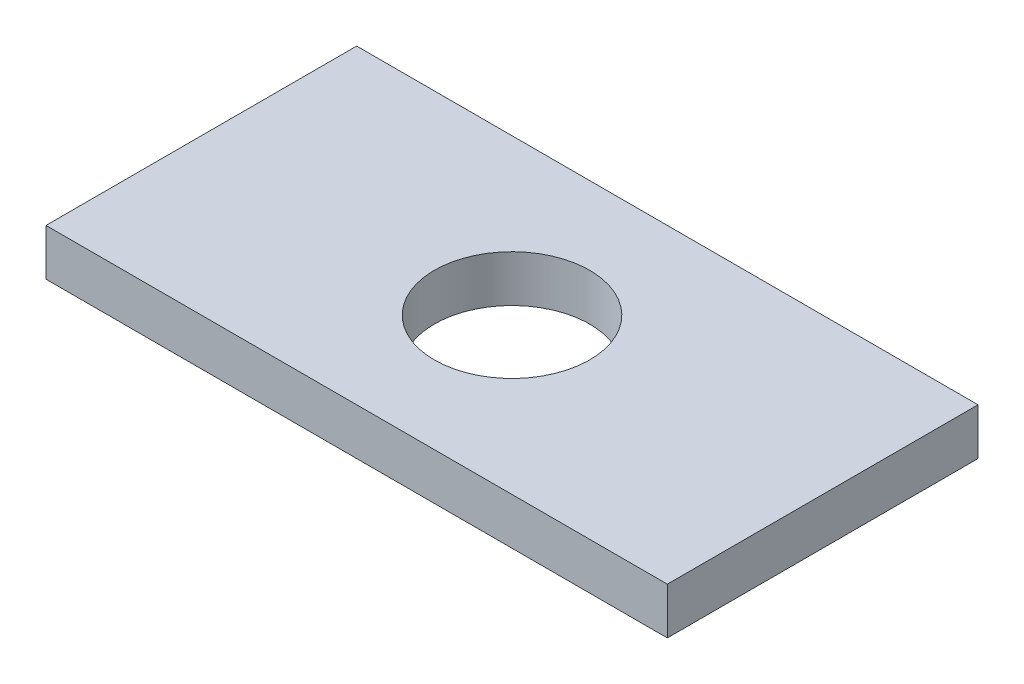
ISO-10303-21;
HEADER;
FILE_DESCRIPTION(('STEP AP214'),'2;1');
FILE_NAME('part.step','',(''),(''),'','','');
FILE_SCHEMA(('AUTOMOTIVE_DESIGN { 1 0 10303 214 1 1 1 1 }'));
ENDSEC;
DATA;
#1=APPLICATION_CONTEXT('core data for automotive mechanical design processes');
#2=APPLICATION_PROTOCOL_DEFINITION('international standard','automotive_design',2000,#1);
#3=PRODUCT_CONTEXT('',#1,'mechanical');
#4=PRODUCT('Part','Part','',(#3));
#5=PRODUCT_RELATED_PRODUCT_CATEGORY('part','',(#4));
#6=PRODUCT_DEFINITION_FORMATION('','',#4);
#7=PRODUCT_DEFINITION_CONTEXT('part definition',#1,'design');
#8=PRODUCT_DEFINITION('design','',#6,#7);
#9=PRODUCT_DEFINITION_SHAPE('','',#8);
#10=(LENGTH_UNIT() NAMED_UNIT(*) SI_UNIT(.MILLI.,.METRE.));
#11=(NAMED_UNIT(*) PLANE_ANGLE_UNIT() SI_UNIT($,.RADIAN.));
#12=(NAMED_UNIT(*) SI_UNIT($,.STERADIAN.) SOLID_ANGLE_UNIT());
#13=UNCERTAINTY_MEASURE_WITH_UNIT(LENGTH_MEASURE(1.E-05),#10,'distance_accuracy_value','');
#14=(GEOMETRIC_REPRESENTATION_CONTEXT(3) GLOBAL_UNCERTAINTY_ASSIGNED_CONTEXT((#13)) GLOBAL_UNIT_ASSIGNED_CONTEXT((#10,
#11,#12)) REPRESENTATION_CONTEXT('',''));
#15=CARTESIAN_POINT('',(0.,0.,0.));
#16=DIRECTION('',(0.,0.,1.));
#17=DIRECTION('',(1.,0.,0.));
#18=AXIS2_PLACEMENT_3D('',#15,#16,#17);
#19=CARTESIAN_POINT('',(20.,-3.,10.));
#20=DIRECTION('',(1.,0.,0.));
#21=DIRECTION('',(0.,0.,-1.));
#22=AXIS2_PLACEMENT_3D('',#19,#20,#21);
#23=PLANE('',#22);
#24=DIRECTION('',(0.,0.,-1.));
#25=VECTOR('',#24,1.);
#26=CARTESIAN_POINT('',(20.,0.,10.));
#27=LINE('',#26,#25);
#28=CARTESIAN_POINT('',(20.,0.,10.));
#29=VERTEX_POINT('',#28);
#30=CARTESIAN_POINT('',(20.,0.,-10.));
#31=VERTEX_POINT('',#30);
#32=EDGE_CURVE('E100',#29,#31,#27,.T.);
#33=ORIENTED_EDGE('',*,*,#32,.F.);
#34=DIRECTION('',(0.,1.,0.));
#35=VECTOR('',#34,1.);
#36=CARTESIAN_POINT('',(20.,-3.,10.));
#37=LINE('',#36,#35);
#38=CARTESIAN_POINT('',(20.,-3.,10.));
#39=VERTEX_POINT('',#38);
#40=EDGE_CURVE('E11',#39,#29,#37,.T.);
#41=ORIENTED_EDGE('',*,*,#40,.F.);
#42=DIRECTION('',(0.,0.,-1.));
#43=VECTOR('',#42,1.);
#44=CARTESIAN_POINT('',(20.,-3.,10.));
#45=LINE('',#44,#43);
#46=CARTESIAN_POINT('',(20.,-3.,-10.));
#47=VERTEX_POINT('',#46);
#48=EDGE_CURVE('E93',#39,#47,#45,.T.);
#49=ORIENTED_EDGE('',*,*,#48,.T.);
#50=DIRECTION('',(0.,1.,0.));
#51=VECTOR('',#50,1.);
#52=CARTESIAN_POINT('',(20.,-3.,-10.));
#53=LINE('',#52,#51);
#54=EDGE_CURVE('E38',#47,#31,#53,.T.);
#55=ORIENTED_EDGE('',*,*,#54,.T.);
#56=EDGE_LOOP('',(#33,#41,#49,#55));
#57=FACE_BOUND('',#56,.T.);
#58=ADVANCED_FACE('F35',(#57),#23,.T.);
#59=CARTESIAN_POINT('',(-20.,-3.,10.));
#60=DIRECTION('',(0.,0.,1.));
#61=DIRECTION('',(1.,0.,0.));
#62=AXIS2_PLACEMENT_3D('',#59,#60,#61);
#63=PLANE('',#62);
#64=DIRECTION('',(1.,0.,0.));
#65=VECTOR('',#64,1.);
#66=CARTESIAN_POINT('',(-20.,0.,10.));
#67=LINE('',#66,#65);
#68=CARTESIAN_POINT('',(-20.,0.,10.));
#69=VERTEX_POINT('',#68);
#70=EDGE_CURVE('E95',#69,#29,#67,.T.);
#71=ORIENTED_EDGE('',*,*,#70,.F.);
#72=DIRECTION('',(0.,1.,0.));
#73=VECTOR('',#72,1.);
#74=CARTESIAN_POINT('',(-20.,-3.,10.));
#75=LINE('',#74,#73);
#76=CARTESIAN_POINT('',(-20.,-3.,10.));
#77=VERTEX_POINT('',#76);
#78=EDGE_CURVE('E44',#77,#69,#75,.T.);
#79=ORIENTED_EDGE('',*,*,#78,.F.);
#80=DIRECTION('',(1.,0.,0.));
#81=VECTOR('',#80,1.);
#82=CARTESIAN_POINT('',(-20.,-3.,10.));
#83=LINE('',#82,#81);
#84=EDGE_CURVE('E90',#77,#39,#83,.T.);
#85=ORIENTED_EDGE('',*,*,#84,.T.);
#86=ORIENTED_EDGE('',*,*,#40,.T.);
#87=EDGE_LOOP('',(#71,#79,#85,#86));
#88=FACE_BOUND('',#87,.T.);
#89=ADVANCED_FACE('F111',(#88),#63,.T.);
#90=CARTESIAN_POINT('',(-20.,-3.,10.));
#91=DIRECTION('',(-1.,0.,0.));
#92=DIRECTION('',(0.,0.,1.));
#93=AXIS2_PLACEMENT_3D('',#90,#91,#92);
#94=PLANE('',#93);
#95=DIRECTION('',(0.,0.,1.));
#96=VECTOR('',#95,1.);
#97=CARTESIAN_POINT('',(-20.,0.,10.));
#98=LINE('',#97,#96);
#99=CARTESIAN_POINT('',(-20.,0.,-10.));
#100=VERTEX_POINT('',#99);
#101=EDGE_CURVE('E85',#100,#69,#98,.T.);
#102=ORIENTED_EDGE('',*,*,#101,.F.);
#103=DIRECTION('',(0.,1.,0.));
#104=VECTOR('',#103,1.);
#105=CARTESIAN_POINT('',(-20.,-3.,-10.));
#106=LINE('',#105,#104);
#107=CARTESIAN_POINT('',(-20.,-3.,-10.));
#108=VERTEX_POINT('',#107);
#109=EDGE_CURVE('E80',#108,#100,#106,.T.);
#110=ORIENTED_EDGE('',*,*,#109,.F.);
#111=DIRECTION('',(0.,0.,1.));
#112=VECTOR('',#111,1.);
#113=CARTESIAN_POINT('',(-20.,-3.,10.));
#114=LINE('',#113,#112);
#115=EDGE_CURVE('E83',#108,#77,#114,.T.);
#116=ORIENTED_EDGE('',*,*,#115,.T.);
#117=ORIENTED_EDGE('',*,*,#78,.T.);
#118=EDGE_LOOP('',(#102,#110,#116,#117));
#119=FACE_BOUND('',#118,.T.);
#120=ADVANCED_FACE('F82',(#119),#94,.T.);
#121=CARTESIAN_POINT('',(-20.,-3.,-10.));
#122=DIRECTION('',(0.,0.,-1.));
#123=DIRECTION('',(-1.,0.,0.));
#124=AXIS2_PLACEMENT_3D('',#121,#122,#123);
#125=PLANE('',#124);
#126=DIRECTION('',(-1.,0.,0.));
#127=VECTOR('',#126,1.);
#128=CARTESIAN_POINT('',(-20.,0.,-10.));
#129=LINE('',#128,#127);
#130=EDGE_CURVE('E103',#31,#100,#129,.T.);
#131=ORIENTED_EDGE('',*,*,#130,.F.);
#132=ORIENTED_EDGE('',*,*,#54,.F.);
#133=DIRECTION('',(-1.,0.,0.));
#134=VECTOR('',#133,1.);
#135=CARTESIAN_POINT('',(-20.,-3.,-10.));
#136=LINE('',#135,#134);
#137=EDGE_CURVE('E89',#47,#108,#136,.T.);
#138=ORIENTED_EDGE('',*,*,#137,.T.);
#139=ORIENTED_EDGE('',*,*,#109,.T.);
#140=EDGE_LOOP('',(#131,#132,#138,#139));
#141=FACE_BOUND('',#140,.T.);
#142=ADVANCED_FACE('F92',(#141),#125,.T.);
#143=CARTESIAN_POINT('',(20.,-3.,-10.));
#144=DIRECTION('',(0.,-1.,0.));
#145=DIRECTION('',(0.,0.,-1.));
#146=AXIS2_PLACEMENT_3D('',#143,#144,#145);
#147=PLANE('',#146);
#148=CARTESIAN_POINT('',(0.,-3.,0.));
#149=DIRECTION('',(0.,1.,0.));
#150=DIRECTION('',(0.,0.,1.));
#151=AXIS2_PLACEMENT_3D('',#148,#149,#150);
#152=CIRCLE('',#151,5.);
#153=CARTESIAN_POINT('',(0.,-3.,5.));
#154=VERTEX_POINT('',#153);
#155=EDGE_CURVE('E104',#154,#154,#152,.T.);
#156=ORIENTED_EDGE('',*,*,#155,.T.);
#157=EDGE_LOOP('',(#156));
#158=FACE_BOUND('',#157,.T.);
#159=ORIENTED_EDGE('',*,*,#48,.F.);
#160=ORIENTED_EDGE('',*,*,#84,.F.);
#161=ORIENTED_EDGE('',*,*,#115,.F.);
#162=ORIENTED_EDGE('',*,*,#137,.F.);
#163=EDGE_LOOP('',(#159,#160,#161,#162));
#164=FACE_BOUND('',#163,.T.);
#165=ADVANCED_FACE('F88',(#158,#164),#147,.T.);
#166=CARTESIAN_POINT('',(20.,0.,-10.));
#167=DIRECTION('',(0.,-1.,0.));
#168=DIRECTION('',(0.,0.,-1.));
#169=AXIS2_PLACEMENT_3D('',#166,#167,#168);
#170=PLANE('',#169);
#171=CARTESIAN_POINT('',(0.,0.,0.));
#172=DIRECTION('',(0.,1.,0.));
#173=DIRECTION('',(0.,0.,1.));
#174=AXIS2_PLACEMENT_3D('',#171,#172,#173);
#175=CIRCLE('',#174,5.);
#176=CARTESIAN_POINT('',(0.,0.,5.));
#177=VERTEX_POINT('',#176);
#178=EDGE_CURVE('E141',#177,#177,#175,.T.);
#179=ORIENTED_EDGE('',*,*,#178,.F.);
#180=EDGE_LOOP('',(#179));
#181=FACE_BOUND('',#180,.T.);
#182=ORIENTED_EDGE('',*,*,#32,.T.);
#183=ORIENTED_EDGE('',*,*,#130,.T.);
#184=ORIENTED_EDGE('',*,*,#101,.T.);
#185=ORIENTED_EDGE('',*,*,#70,.T.);
#186=EDGE_LOOP('',(#182,#183,#184,#185));
#187=FACE_BOUND('',#186,.T.);
#188=ADVANCED_FACE('F110',(#181,#187),#170,.F.);
#189=CARTESIAN_POINT('',(0.,-3.,0.));
#190=DIRECTION('',(0.,1.,0.));
#191=DIRECTION('',(0.,0.,1.));
#192=AXIS2_PLACEMENT_3D('',#189,#190,#191);
#193=CYLINDRICAL_SURFACE('',#192,5.);
#194=ORIENTED_EDGE('',*,*,#155,.F.);
#195=EDGE_LOOP('',(#194));
#196=FACE_BOUND('',#195,.T.);
#197=ORIENTED_EDGE('',*,*,#178,.T.);
#198=EDGE_LOOP('',(#197));
#199=FACE_BOUND('',#198,.T.);
#200=ADVANCED_FACE('F129',(#196,#199),#193,.F.);
#201=CLOSED_SHELL('',(#58,#89,#120,#142,#165,#188,#200));
#202=MANIFOLD_SOLID_BREP('B2',#201);
#203=ADVANCED_BREP_SHAPE_REPRESENTATION('',(#18,#202),#14);
#204=SHAPE_DEFINITION_REPRESENTATION(#9,#203);
ENDSEC;
END-ISO-10303-21;
